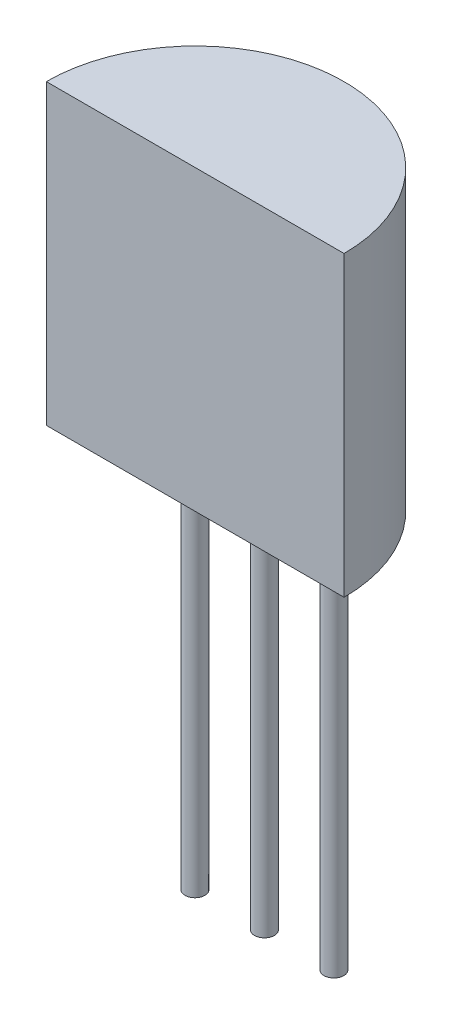
ISO-10303-21;
HEADER;
FILE_DESCRIPTION(('STEP AP214'),'2;1');
FILE_NAME('part.step','',(''),(''),'','','');
FILE_SCHEMA(('AUTOMOTIVE_DESIGN { 1 0 10303 214 1 1 1 1 }'));
ENDSEC;
DATA;
#1=APPLICATION_CONTEXT('core data for automotive mechanical design processes');
#2=APPLICATION_PROTOCOL_DEFINITION('international standard','automotive_design',2000,#1);
#3=PRODUCT_CONTEXT('',#1,'mechanical');
#4=PRODUCT('Part','Part','',(#3));
#5=PRODUCT_RELATED_PRODUCT_CATEGORY('part','',(#4));
#6=PRODUCT_DEFINITION_FORMATION('','',#4);
#7=PRODUCT_DEFINITION_CONTEXT('part definition',#1,'design');
#8=PRODUCT_DEFINITION('design','',#6,#7);
#9=PRODUCT_DEFINITION_SHAPE('','',#8);
#10=(LENGTH_UNIT() NAMED_UNIT(*) SI_UNIT(.MILLI.,.METRE.));
#11=(NAMED_UNIT(*) PLANE_ANGLE_UNIT() SI_UNIT($,.RADIAN.));
#12=(NAMED_UNIT(*) SI_UNIT($,.STERADIAN.) SOLID_ANGLE_UNIT());
#13=UNCERTAINTY_MEASURE_WITH_UNIT(LENGTH_MEASURE(1.E-05),#10,'distance_accuracy_value','');
#14=(GEOMETRIC_REPRESENTATION_CONTEXT(3) GLOBAL_UNCERTAINTY_ASSIGNED_CONTEXT((#13)) GLOBAL_UNIT_ASSIGNED_CONTEXT((#10,
#11,#12)) REPRESENTATION_CONTEXT('',''));
#15=CARTESIAN_POINT('',(0.,0.,0.));
#16=DIRECTION('',(0.,0.,1.));
#17=DIRECTION('',(1.,0.,0.));
#18=AXIS2_PLACEMENT_3D('',#15,#16,#17);
#19=CARTESIAN_POINT('',(7.5,15.,0.));
#20=DIRECTION('',(0.,-1.,0.));
#21=DIRECTION('',(0.,0.,-1.));
#22=AXIS2_PLACEMENT_3D('',#19,#20,#21);
#23=CYLINDRICAL_SURFACE('',#22,7.5);
#24=CARTESIAN_POINT('',(4.5,7.5,-6.87386354243376));
#25=CARTESIAN_POINT('',(4.50000689897966,7.33931446543056,-6.87387034169605));
#26=CARTESIAN_POINT('',(4.5129873966989,7.17836055850223,-6.87957650695683));
#27=CARTESIAN_POINT('',(4.56439933687765,6.86109137385064,-6.901666249599));
#28=CARTESIAN_POINT('',(4.60289581451489,6.70478901849222,-6.9180771094252));
#29=CARTESIAN_POINT('',(4.70364668285677,6.40192228654376,-6.95940616078833));
#30=CARTESIAN_POINT('',(4.76581156502174,6.25532363506317,-6.98429226391323));
#31=CARTESIAN_POINT('',(4.91186980208772,5.97467196770655,-7.0397201578331));
#32=CARTESIAN_POINT('',(4.9957584126344,5.84061622121384,-7.07026071330917));
#33=CARTESIAN_POINT('',(5.18801697865119,5.5811095281835,-7.13551292343503));
#34=CARTESIAN_POINT('',(5.29743094745174,5.45646540090413,-7.17035875533909));
#35=CARTESIAN_POINT('',(5.53543635730177,5.22670646871629,-7.23918686872916));
#36=CARTESIAN_POINT('',(5.6640344718398,5.12159848843544,-7.27316884487642));
#37=CARTESIAN_POINT('',(5.94299052994046,4.92989041453543,-7.33805111462092));
#38=CARTESIAN_POINT('',(6.09400655037136,4.84418355047109,-7.36877705418855));
#39=CARTESIAN_POINT('',(6.40976201689704,4.69973464473932,-7.42205891553774));
#40=CARTESIAN_POINT('',(6.57449584638468,4.6409816306267,-7.44461816104874));
#41=CARTESIAN_POINT('',(6.90455035944037,4.55498777101037,-7.47807487485913));
#42=CARTESIAN_POINT('',(7.06945652271253,4.52635902904467,-7.48948405155942));
#43=CARTESIAN_POINT('',(7.40210050712406,4.49695727132783,-7.50120466031146));
#44=CARTESIAN_POINT('',(7.56983724875912,4.4961738660513,-7.50152023155834));
#45=CARTESIAN_POINT('',(7.89334874205313,4.5217241547063,-7.49132944230918));
#46=CARTESIAN_POINT('',(8.04926617930569,4.54653715913207,-7.48142995157228));
#47=CARTESIAN_POINT('',(8.35450966383287,4.61998931445445,-7.45273937203712));
#48=CARTESIAN_POINT('',(8.50383522658686,4.6686302135977,-7.43394763082012));
#49=CARTESIAN_POINT('',(8.79434690776584,4.78895472431738,-7.388952366862));
#50=CARTESIAN_POINT('',(8.93537643506834,4.86097457222307,-7.36264140699335));
#51=CARTESIAN_POINT('',(9.20371222611197,5.02569751037873,-7.30521877770412));
#52=CARTESIAN_POINT('',(9.33101376407694,5.11840768965025,-7.27410546400724));
#53=CARTESIAN_POINT('',(9.57715324198526,5.32897370391582,-7.20782455764184));
#54=CARTESIAN_POINT('',(9.69488676789948,5.4480808388592,-7.17252489767638));
#55=CARTESIAN_POINT('',(9.90916112308897,5.704485857748,-7.10342491459894));
#56=CARTESIAN_POINT('',(10.0056950156805,5.84178967229341,-7.06962508512114));
#57=CARTESIAN_POINT('',(10.1773562830789,6.13562853356091,-7.00645346113535));
#58=CARTESIAN_POINT('',(10.2518019774544,6.29259724550797,-6.97723371086562));
#59=CARTESIAN_POINT('',(10.3727643897997,6.61832323546833,-6.92831385516127));
#60=CARTESIAN_POINT('',(10.419299247567,6.78707277708988,-6.90860756836966));
#61=CARTESIAN_POINT('',(10.4804324232823,7.12055366620115,-6.88244639554074));
#62=CARTESIAN_POINT('',(10.4968081452218,7.28490067069283,-6.87525549684207));
#63=CARTESIAN_POINT('',(10.5023419896643,7.61411581163934,-6.87284246803558));
#64=CARTESIAN_POINT('',(10.4915083658869,7.77898377491348,-6.87761670840543));
#65=CARTESIAN_POINT('',(10.444549342185,8.09468840243541,-6.8978406653867));
#66=CARTESIAN_POINT('',(10.4098995930358,8.24578940610009,-6.91266686697452));
#67=CARTESIAN_POINT('',(10.3182062803663,8.53993260717818,-6.9505507654101));
#68=CARTESIAN_POINT('',(10.2611577514534,8.68297300966072,-6.97361028732897));
#69=CARTESIAN_POINT('',(10.1237034592224,8.96340353669348,-7.02650672790152));
#70=CARTESIAN_POINT('',(10.042444302397,9.1003292830418,-7.05658056958766));
#71=CARTESIAN_POINT('',(9.85974783666273,9.35922448116238,-7.11975577736692));
#72=CARTESIAN_POINT('',(9.75830231022284,9.48118780919317,-7.15285837344067));
#73=CARTESIAN_POINT('',(9.52926631752087,9.71606011289905,-7.22131373957124));
#74=CARTESIAN_POINT('',(9.40029814416816,9.82763484793739,-7.2566521092785));
#75=CARTESIAN_POINT('',(9.12462545005276,10.0277656149147,-7.32329691851298));
#76=CARTESIAN_POINT('',(8.97792020769992,10.1163207098927,-7.35460319389703));
#77=CARTESIAN_POINT('',(8.67041990100453,10.267571439695,-7.40975573850584));
#78=CARTESIAN_POINT('',(8.50962822149812,10.3302732662605,-7.4336037936099));
#79=CARTESIAN_POINT('',(8.17859038637182,10.4273232785996,-7.47109070203356));
#80=CARTESIAN_POINT('',(8.00834941541523,10.461686852116,-7.48473509559155));
#81=CARTESIAN_POINT('',(7.67522476554392,10.4992570524793,-7.49968512317788));
#82=CARTESIAN_POINT('',(7.51258573897813,10.504350192843,-7.50173770124618));
#83=CARTESIAN_POINT('',(7.1888492463116,10.4882167809248,-7.49529063560582));
#84=CARTESIAN_POINT('',(7.02775155057842,10.4669942127666,-7.48679258923161));
#85=CARTESIAN_POINT('',(6.71674364739991,10.4001798180002,-7.46057270072754));
#86=CARTESIAN_POINT('',(6.5666417942027,10.3553565828652,-7.44314221048496));
#87=CARTESIAN_POINT('',(6.2761164666861,10.2434207911784,-7.40092421651037));
#88=CARTESIAN_POINT('',(6.13569478321632,10.1763041235914,-7.37613535594289));
#89=CARTESIAN_POINT('',(5.86169544179227,10.0183452099701,-7.32027141917801));
#90=CARTESIAN_POINT('',(5.72869443721893,9.9265855870123,-7.288966960308));
#91=CARTESIAN_POINT('',(5.4794189397781,9.72331719187951,-7.2238410334062));
#92=CARTESIAN_POINT('',(5.36315140620398,9.61180024558768,-7.19001852696379));
#93=CARTESIAN_POINT('',(5.14319817158326,9.36402727972701,-7.1210665105152));
#94=CARTESIAN_POINT('',(5.04073693495837,9.22666713728385,-7.08598570842144));
#95=CARTESIAN_POINT('',(4.86022855855276,8.93558634641876,-7.02074485276124));
#96=CARTESIAN_POINT('',(4.78218428916349,8.78186377731968,-6.99058537793172));
#97=CARTESIAN_POINT('',(4.65901427322549,8.4764457202947,-6.94138371358595));
#98=CARTESIAN_POINT('',(4.61156196502099,8.32580759593134,-6.92158645020622));
#99=CARTESIAN_POINT('',(4.54092013607266,8.01826643776104,-6.8916873905118));
#100=CARTESIAN_POINT('',(4.51766300712589,7.86138213986347,-6.88155858435653));
#101=CARTESIAN_POINT('',(4.50461696721731,7.66983264133272,-6.87587645913135));
#102=CARTESIAN_POINT('',(4.50288703872157,7.63589777946535,-6.87512296675926));
#103=CARTESIAN_POINT('',(4.50057778313625,7.56797928480416,-6.87411577084084));
#104=CARTESIAN_POINT('',(4.4999985404082,7.53399564861726,-6.8738621039388));
#105=CARTESIAN_POINT('',(4.5,7.5,-6.87386354243376));
#106=B_SPLINE_CURVE_WITH_KNOTS('',3,(#24,#25,#26,#27,#28,#29,#30,#31,#32,#33,#34,#35,#36,#37,
#38,#39,#40,#41,#42,#43,#44,#45,#46,#47,#48,#49,#50,#51,#52,#53,#54,#55,#56,#57,#58,#59,#60,#61,
#62,#63,#64,#65,#66,#67,#68,#69,#70,#71,#72,#73,#74,#75,#76,#77,#78,#79,#80,#81,#82,#83,#84,#85,
#86,#87,#88,#89,#90,#91,#92,#93,#94,#95,#96,#97,#98,#99,#100,#101,#102,#103,#104,#105),
.UNSPECIFIED.,.T.,.F.,(4,2,2,2,2,2,2,2,2,2,2,2,2,2,2,2,2,2,2,2,2,2,2,2,2,2,2,2,2,2,2,2,2,2,2,2,
2,2,2,2,4),(0.,0.481916473151481,0.965066003733368,1.44640623494009,1.92764143235792,
2.43383427426637,2.94020361522513,3.46654003637142,3.9926620045422,4.49331274330775,
4.99377667958508,5.46612967245453,5.93851732693589,6.41802450352347,6.89769622410047,
7.40886066122033,7.9201921069069,8.44596688075886,8.97139957200152,9.4647322128663,
9.95791522361909,10.4230087212772,10.8882053797746,11.3722673197905,11.8565267178877,
12.3765560137047,12.8966064727912,13.4165323096922,13.936175639312,14.4219155963393,
14.907582022689,15.3783299166503,15.8491646674288,16.3408057670989,16.8326507484631,
17.3549437992842,17.8772982263878,18.3527499122861,18.8268694532887,18.928819278144,
19.0307765770883),.UNSPECIFIED.);
#107=CARTESIAN_POINT('',(4.5,7.5,-6.87386354243376));
#108=VERTEX_POINT('',#107);
#109=EDGE_CURVE('E11',#108,#108,#106,.T.);
#110=ORIENTED_EDGE('',*,*,#109,.T.);
#111=EDGE_LOOP('',(#110));
#112=FACE_BOUND('',#111,.T.);
#113=CARTESIAN_POINT('',(7.5,0.,0.));
#114=DIRECTION('',(0.,1.,0.));
#115=DIRECTION('',(0.,0.,1.));
#116=AXIS2_PLACEMENT_3D('',#113,#114,#115);
#117=CIRCLE('',#116,7.5);
#118=CARTESIAN_POINT('',(15.,0.,0.));
#119=VERTEX_POINT('',#118);
#120=CARTESIAN_POINT('',(0.,0.,0.));
#121=VERTEX_POINT('',#120);
#122=EDGE_CURVE('E81',#119,#121,#117,.T.);
#123=ORIENTED_EDGE('',*,*,#122,.T.);
#124=DIRECTION('',(0.,-1.,0.));
#125=VECTOR('',#124,1.);
#126=CARTESIAN_POINT('',(0.,15.,0.));
#127=LINE('',#126,#125);
#128=CARTESIAN_POINT('',(0.,15.,0.));
#129=VERTEX_POINT('',#128);
#130=EDGE_CURVE('E55',#129,#121,#127,.T.);
#131=ORIENTED_EDGE('',*,*,#130,.F.);
#132=CARTESIAN_POINT('',(7.5,15.,0.));
#133=DIRECTION('',(0.,1.,0.));
#134=DIRECTION('',(0.,0.,1.));
#135=AXIS2_PLACEMENT_3D('',#132,#133,#134);
#136=CIRCLE('',#135,7.5);
#137=CARTESIAN_POINT('',(15.,15.,0.));
#138=VERTEX_POINT('',#137);
#139=EDGE_CURVE('E80',#138,#129,#136,.T.);
#140=ORIENTED_EDGE('',*,*,#139,.F.);
#141=DIRECTION('',(0.,-1.,0.));
#142=VECTOR('',#141,1.);
#143=CARTESIAN_POINT('',(15.,15.,0.));
#144=LINE('',#143,#142);
#145=EDGE_CURVE('E75',#138,#119,#144,.T.);
#146=ORIENTED_EDGE('',*,*,#145,.T.);
#147=EDGE_LOOP('',(#123,#131,#140,#146));
#148=FACE_BOUND('',#147,.T.);
#149=ADVANCED_FACE('F41',(#112,#148),#23,.T.);
#150=CARTESIAN_POINT('',(0.,15.,0.));
#151=DIRECTION('',(0.,0.,-1.));
#152=DIRECTION('',(-1.,0.,0.));
#153=AXIS2_PLACEMENT_3D('',#150,#151,#152);
#154=PLANE('',#153);
#155=DIRECTION('',(1.,0.,0.));
#156=VECTOR('',#155,1.);
#157=CARTESIAN_POINT('',(0.,0.,0.));
#158=LINE('',#157,#156);
#159=EDGE_CURVE('E70',#121,#119,#158,.T.);
#160=ORIENTED_EDGE('',*,*,#159,.T.);
#161=ORIENTED_EDGE('',*,*,#145,.F.);
#162=DIRECTION('',(1.,0.,0.));
#163=VECTOR('',#162,1.);
#164=CARTESIAN_POINT('',(0.,15.,0.));
#165=LINE('',#164,#163);
#166=EDGE_CURVE('E62',#129,#138,#165,.T.);
#167=ORIENTED_EDGE('',*,*,#166,.F.);
#168=ORIENTED_EDGE('',*,*,#130,.T.);
#169=EDGE_LOOP('',(#160,#161,#167,#168));
#170=FACE_BOUND('',#169,.T.);
#171=ADVANCED_FACE('F74',(#170),#154,.F.);
#172=CARTESIAN_POINT('',(7.5,15.,0.));
#173=DIRECTION('',(0.,1.,0.));
#174=DIRECTION('',(0.,0.,1.));
#175=AXIS2_PLACEMENT_3D('',#172,#173,#174);
#176=PLANE('',#175);
#177=ORIENTED_EDGE('',*,*,#139,.T.);
#178=ORIENTED_EDGE('',*,*,#166,.T.);
#179=EDGE_LOOP('',(#177,#178));
#180=FACE_BOUND('',#179,.T.);
#181=ADVANCED_FACE('F129',(#180),#176,.T.);
#182=CARTESIAN_POINT('',(7.5,0.,0.));
#183=DIRECTION('',(0.,1.,0.));
#184=DIRECTION('',(0.,0.,1.));
#185=AXIS2_PLACEMENT_3D('',#182,#183,#184);
#186=PLANE('',#185);
#187=CARTESIAN_POINT('',(4.,0.,-3.48861721497316));
#188=DIRECTION('',(0.,-1.,0.));
#189=DIRECTION('',(0.,0.,-1.));
#190=AXIS2_PLACEMENT_3D('',#187,#188,#189);
#191=CIRCLE('',#190,0.5);
#192=CARTESIAN_POINT('',(4.,0.,-3.98861721497316));
#193=VERTEX_POINT('',#192);
#194=EDGE_CURVE('E119',#193,#193,#191,.T.);
#195=ORIENTED_EDGE('',*,*,#194,.F.);
#196=EDGE_LOOP('',(#195));
#197=FACE_BOUND('',#196,.T.);
#198=CARTESIAN_POINT('',(7.5,0.,-3.48861721497316));
#199=DIRECTION('',(0.,-1.,0.));
#200=DIRECTION('',(0.,0.,-1.));
#201=AXIS2_PLACEMENT_3D('',#198,#199,#200);
#202=CIRCLE('',#201,0.5);
#203=CARTESIAN_POINT('',(7.5,0.,-3.98861721497316));
#204=VERTEX_POINT('',#203);
#205=EDGE_CURVE('E111',#204,#204,#202,.T.);
#206=ORIENTED_EDGE('',*,*,#205,.F.);
#207=EDGE_LOOP('',(#206));
#208=FACE_BOUND('',#207,.T.);
#209=CARTESIAN_POINT('',(11.,0.,-3.48861721497316));
#210=DIRECTION('',(0.,-1.,0.));
#211=DIRECTION('',(0.,0.,-1.));
#212=AXIS2_PLACEMENT_3D('',#209,#210,#211);
#213=CIRCLE('',#212,0.500000000000001);
#214=CARTESIAN_POINT('',(11.,0.,-3.98861721497316));
#215=VERTEX_POINT('',#214);
#216=EDGE_CURVE('E103',#215,#215,#213,.T.);
#217=ORIENTED_EDGE('',*,*,#216,.F.);
#218=EDGE_LOOP('',(#217));
#219=FACE_BOUND('',#218,.T.);
#220=ORIENTED_EDGE('',*,*,#122,.F.);
#221=ORIENTED_EDGE('',*,*,#159,.F.);
#222=EDGE_LOOP('',(#220,#221));
#223=FACE_BOUND('',#222,.T.);
#224=ADVANCED_FACE('F86',(#197,#208,#219,#223),#186,.F.);
#225=CARTESIAN_POINT('',(7.5,7.5,-5.5));
#226=DIRECTION('',(0.,0.,-1.));
#227=DIRECTION('',(-1.,0.,0.));
#228=AXIS2_PLACEMENT_3D('',#225,#226,#227);
#229=CYLINDRICAL_SURFACE('',#228,3.);
#230=CARTESIAN_POINT('',(7.5,7.5,-5.5));
#231=DIRECTION('',(0.,0.,-1.));
#232=DIRECTION('',(-1.,0.,0.));
#233=AXIS2_PLACEMENT_3D('',#230,#231,#232);
#234=CIRCLE('',#233,3.);
#235=CARTESIAN_POINT('',(4.5,7.5,-5.5));
#236=VERTEX_POINT('',#235);
#237=EDGE_CURVE('E88',#236,#236,#234,.T.);
#238=ORIENTED_EDGE('',*,*,#237,.F.);
#239=EDGE_LOOP('',(#238));
#240=FACE_BOUND('',#239,.T.);
#241=ORIENTED_EDGE('',*,*,#109,.F.);
#242=EDGE_LOOP('',(#241));
#243=FACE_BOUND('',#242,.T.);
#244=ADVANCED_FACE('F128',(#240,#243),#229,.F.);
#245=CARTESIAN_POINT('',(7.5,7.5,-5.5));
#246=DIRECTION('',(0.,0.,-1.));
#247=DIRECTION('',(-1.,0.,0.));
#248=AXIS2_PLACEMENT_3D('',#245,#246,#247);
#249=PLANE('',#248);
#250=ORIENTED_EDGE('',*,*,#237,.T.);
#251=EDGE_LOOP('',(#250));
#252=FACE_BOUND('',#251,.T.);
#253=ADVANCED_FACE('F141',(#252),#249,.T.);
#254=CARTESIAN_POINT('',(11.,-20.,-3.48861721497316));
#255=DIRECTION('',(0.,-1.,0.));
#256=DIRECTION('',(0.,0.,-1.));
#257=AXIS2_PLACEMENT_3D('',#254,#255,#256);
#258=PLANE('',#257);
#259=CARTESIAN_POINT('',(11.,-20.,-3.48861721497316));
#260=DIRECTION('',(0.,-1.,0.));
#261=DIRECTION('',(0.,0.,-1.));
#262=AXIS2_PLACEMENT_3D('',#259,#260,#261);
#263=CIRCLE('',#262,0.500000000000001);
#264=CARTESIAN_POINT('',(11.,-20.,-3.98861721497316));
#265=VERTEX_POINT('',#264);
#266=EDGE_CURVE('E92',#265,#265,#263,.T.);
#267=ORIENTED_EDGE('',*,*,#266,.T.);
#268=EDGE_LOOP('',(#267));
#269=FACE_BOUND('',#268,.T.);
#270=ADVANCED_FACE('F138',(#269),#258,.T.);
#271=CARTESIAN_POINT('',(11.,0.,-3.48861721497316));
#272=DIRECTION('',(0.,-1.,0.));
#273=DIRECTION('',(0.,0.,-1.));
#274=AXIS2_PLACEMENT_3D('',#271,#272,#273);
#275=CYLINDRICAL_SURFACE('',#274,0.500000000000001);
#276=ORIENTED_EDGE('',*,*,#266,.F.);
#277=EDGE_LOOP('',(#276));
#278=FACE_BOUND('',#277,.T.);
#279=ORIENTED_EDGE('',*,*,#216,.T.);
#280=EDGE_LOOP('',(#279));
#281=FACE_BOUND('',#280,.T.);
#282=ADVANCED_FACE('F135',(#278,#281),#275,.T.);
#283=CARTESIAN_POINT('',(7.5,-20.,-3.48861721497316));
#284=DIRECTION('',(0.,-1.,0.));
#285=DIRECTION('',(0.,0.,-1.));
#286=AXIS2_PLACEMENT_3D('',#283,#284,#285);
#287=PLANE('',#286);
#288=CARTESIAN_POINT('',(7.5,-20.,-3.48861721497316));
#289=DIRECTION('',(0.,-1.,0.));
#290=DIRECTION('',(0.,0.,-1.));
#291=AXIS2_PLACEMENT_3D('',#288,#289,#290);
#292=CIRCLE('',#291,0.5);
#293=CARTESIAN_POINT('',(7.5,-20.,-3.98861721497316));
#294=VERTEX_POINT('',#293);
#295=EDGE_CURVE('E107',#294,#294,#292,.T.);
#296=ORIENTED_EDGE('',*,*,#295,.T.);
#297=EDGE_LOOP('',(#296));
#298=FACE_BOUND('',#297,.T.);
#299=ADVANCED_FACE('F137',(#298),#287,.T.);
#300=CARTESIAN_POINT('',(7.5,0.,-3.48861721497316));
#301=DIRECTION('',(0.,-1.,0.));
#302=DIRECTION('',(0.,0.,-1.));
#303=AXIS2_PLACEMENT_3D('',#300,#301,#302);
#304=CYLINDRICAL_SURFACE('',#303,0.5);
#305=ORIENTED_EDGE('',*,*,#295,.F.);
#306=EDGE_LOOP('',(#305));
#307=FACE_BOUND('',#306,.T.);
#308=ORIENTED_EDGE('',*,*,#205,.T.);
#309=EDGE_LOOP('',(#308));
#310=FACE_BOUND('',#309,.T.);
#311=ADVANCED_FACE('F146',(#307,#310),#304,.T.);
#312=CARTESIAN_POINT('',(4.,-20.,-3.48861721497316));
#313=DIRECTION('',(0.,-1.,0.));
#314=DIRECTION('',(0.,0.,-1.));
#315=AXIS2_PLACEMENT_3D('',#312,#313,#314);
#316=PLANE('',#315);
#317=CARTESIAN_POINT('',(4.,-20.,-3.48861721497316));
#318=DIRECTION('',(0.,-1.,0.));
#319=DIRECTION('',(0.,0.,-1.));
#320=AXIS2_PLACEMENT_3D('',#317,#318,#319);
#321=CIRCLE('',#320,0.5);
#322=CARTESIAN_POINT('',(4.,-20.,-3.98861721497316));
#323=VERTEX_POINT('',#322);
#324=EDGE_CURVE('E115',#323,#323,#321,.T.);
#325=ORIENTED_EDGE('',*,*,#324,.T.);
#326=EDGE_LOOP('',(#325));
#327=FACE_BOUND('',#326,.T.);
#328=ADVANCED_FACE('F196',(#327),#316,.T.);
#329=CARTESIAN_POINT('',(4.,0.,-3.48861721497316));
#330=DIRECTION('',(0.,-1.,0.));
#331=DIRECTION('',(0.,0.,-1.));
#332=AXIS2_PLACEMENT_3D('',#329,#330,#331);
#333=CYLINDRICAL_SURFACE('',#332,0.5);
#334=ORIENTED_EDGE('',*,*,#324,.F.);
#335=EDGE_LOOP('',(#334));
#336=FACE_BOUND('',#335,.T.);
#337=ORIENTED_EDGE('',*,*,#194,.T.);
#338=EDGE_LOOP('',(#337));
#339=FACE_BOUND('',#338,.T.);
#340=ADVANCED_FACE('F124',(#336,#339),#333,.T.);
#341=CLOSED_SHELL('',(#149,#171,#181,#224,#244,#253,#270,#282,#299,#311,#328,#340));
#342=MANIFOLD_SOLID_BREP('B2',#341);
#343=ADVANCED_BREP_SHAPE_REPRESENTATION('',(#18,#342),#14);
#344=SHAPE_DEFINITION_REPRESENTATION(#9,#343);
ENDSEC;
END-ISO-10303-21;
